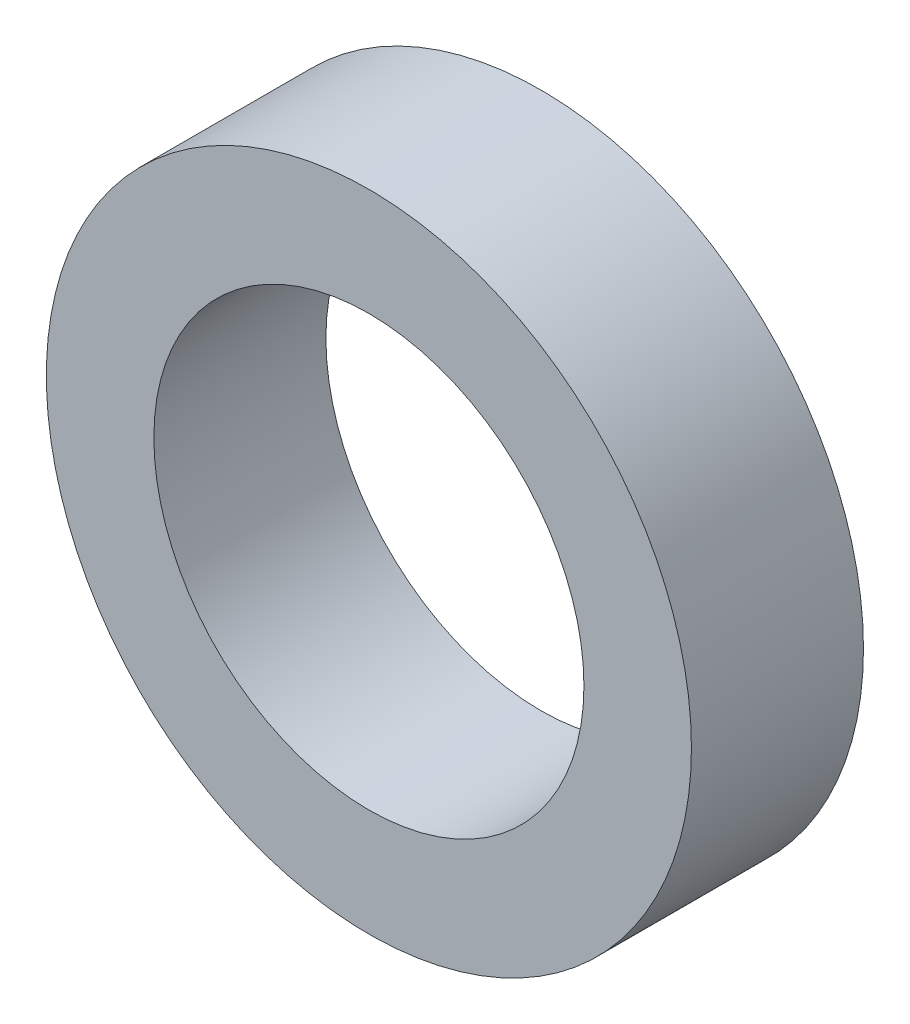
ISO-10303-21;
HEADER;
FILE_DESCRIPTION(('STEP AP214'),'2;1');
FILE_NAME('part.step','',(''),(''),'','','');
FILE_SCHEMA(('AUTOMOTIVE_DESIGN { 1 0 10303 214 1 1 1 1 }'));
ENDSEC;
DATA;
#1=APPLICATION_CONTEXT('core data for automotive mechanical design processes');
#2=APPLICATION_PROTOCOL_DEFINITION('international standard','automotive_design',2000,#1);
#3=PRODUCT_CONTEXT('',#1,'mechanical');
#4=PRODUCT('Part','Part','',(#3));
#5=PRODUCT_RELATED_PRODUCT_CATEGORY('part','',(#4));
#6=PRODUCT_DEFINITION_FORMATION('','',#4);
#7=PRODUCT_DEFINITION_CONTEXT('part definition',#1,'design');
#8=PRODUCT_DEFINITION('design','',#6,#7);
#9=PRODUCT_DEFINITION_SHAPE('','',#8);
#10=(LENGTH_UNIT() NAMED_UNIT(*) SI_UNIT(.MILLI.,.METRE.));
#11=(NAMED_UNIT(*) PLANE_ANGLE_UNIT() SI_UNIT($,.RADIAN.));
#12=(NAMED_UNIT(*) SI_UNIT($,.STERADIAN.) SOLID_ANGLE_UNIT());
#13=UNCERTAINTY_MEASURE_WITH_UNIT(LENGTH_MEASURE(1.E-05),#10,'distance_accuracy_value','');
#14=(GEOMETRIC_REPRESENTATION_CONTEXT(3) GLOBAL_UNCERTAINTY_ASSIGNED_CONTEXT((#13)) GLOBAL_UNIT_ASSIGNED_CONTEXT((#10,
#11,#12)) REPRESENTATION_CONTEXT('',''));
#15=CARTESIAN_POINT('',(0.,0.,0.));
#16=DIRECTION('',(0.,0.,1.));
#17=DIRECTION('',(1.,0.,0.));
#18=AXIS2_PLACEMENT_3D('',#15,#16,#17);
#19=CARTESIAN_POINT('',(0.,0.,4.));
#20=DIRECTION('',(0.,0.,1.));
#21=DIRECTION('',(1.,0.,0.));
#22=AXIS2_PLACEMENT_3D('',#19,#20,#21);
#23=PLANE('',#22);
#24=CARTESIAN_POINT('',(0.,0.,4.));
#25=DIRECTION('',(0.,0.,1.));
#26=DIRECTION('',(1.,0.,0.));
#27=AXIS2_PLACEMENT_3D('',#24,#25,#26);
#28=CIRCLE('',#27,7.5);
#29=CARTESIAN_POINT('',(7.5,0.,4.));
#30=VERTEX_POINT('',#29);
#31=EDGE_CURVE('E10',#30,#30,#28,.T.);
#32=ORIENTED_EDGE('',*,*,#31,.T.);
#33=EDGE_LOOP('',(#32));
#34=FACE_BOUND('',#33,.T.);
#35=CARTESIAN_POINT('',(0.,0.,4.));
#36=DIRECTION('',(0.,0.,1.));
#37=DIRECTION('',(1.,0.,0.));
#38=AXIS2_PLACEMENT_3D('',#35,#36,#37);
#39=CIRCLE('',#38,5.);
#40=CARTESIAN_POINT('',(5.,0.,4.));
#41=VERTEX_POINT('',#40);
#42=EDGE_CURVE('E41',#41,#41,#39,.T.);
#43=ORIENTED_EDGE('',*,*,#42,.F.);
#44=EDGE_LOOP('',(#43));
#45=FACE_BOUND('',#44,.T.);
#46=ADVANCED_FACE('F30',(#34,#45),#23,.T.);
#47=CARTESIAN_POINT('',(0.,0.,0.));
#48=DIRECTION('',(0.,0.,1.));
#49=DIRECTION('',(1.,0.,0.));
#50=AXIS2_PLACEMENT_3D('',#47,#48,#49);
#51=PLANE('',#50);
#52=CARTESIAN_POINT('',(0.,0.,0.));
#53=DIRECTION('',(0.,0.,1.));
#54=DIRECTION('',(1.,0.,0.));
#55=AXIS2_PLACEMENT_3D('',#52,#53,#54);
#56=CIRCLE('',#55,7.5);
#57=CARTESIAN_POINT('',(7.5,0.,0.));
#58=VERTEX_POINT('',#57);
#59=EDGE_CURVE('E34',#58,#58,#56,.T.);
#60=ORIENTED_EDGE('',*,*,#59,.F.);
#61=EDGE_LOOP('',(#60));
#62=FACE_BOUND('',#61,.T.);
#63=CARTESIAN_POINT('',(0.,0.,0.));
#64=DIRECTION('',(0.,0.,1.));
#65=DIRECTION('',(1.,0.,0.));
#66=AXIS2_PLACEMENT_3D('',#63,#64,#65);
#67=CIRCLE('',#66,5.);
#68=CARTESIAN_POINT('',(5.,0.,0.));
#69=VERTEX_POINT('',#68);
#70=EDGE_CURVE('E43',#69,#69,#67,.T.);
#71=ORIENTED_EDGE('',*,*,#70,.T.);
#72=EDGE_LOOP('',(#71));
#73=FACE_BOUND('',#72,.T.);
#74=ADVANCED_FACE('F53',(#62,#73),#51,.F.);
#75=CARTESIAN_POINT('',(0.,0.,4.));
#76=DIRECTION('',(0.,0.,-1.));
#77=DIRECTION('',(-1.,0.,0.));
#78=AXIS2_PLACEMENT_3D('',#75,#76,#77);
#79=CYLINDRICAL_SURFACE('',#78,7.5);
#80=ORIENTED_EDGE('',*,*,#31,.F.);
#81=EDGE_LOOP('',(#80));
#82=FACE_BOUND('',#81,.T.);
#83=ORIENTED_EDGE('',*,*,#59,.T.);
#84=EDGE_LOOP('',(#83));
#85=FACE_BOUND('',#84,.T.);
#86=ADVANCED_FACE('F32',(#82,#85),#79,.T.);
#87=CARTESIAN_POINT('',(0.,0.,4.));
#88=DIRECTION('',(0.,0.,-1.));
#89=DIRECTION('',(-1.,0.,0.));
#90=AXIS2_PLACEMENT_3D('',#87,#88,#89);
#91=CYLINDRICAL_SURFACE('',#90,5.);
#92=ORIENTED_EDGE('',*,*,#42,.T.);
#93=EDGE_LOOP('',(#92));
#94=FACE_BOUND('',#93,.T.);
#95=ORIENTED_EDGE('',*,*,#70,.F.);
#96=EDGE_LOOP('',(#95));
#97=FACE_BOUND('',#96,.T.);
#98=ADVANCED_FACE('F49',(#94,#97),#91,.F.);
#99=CLOSED_SHELL('',(#46,#74,#86,#98));
#100=MANIFOLD_SOLID_BREP('B2',#99);
#101=ADVANCED_BREP_SHAPE_REPRESENTATION('',(#18,#100),#14);
#102=SHAPE_DEFINITION_REPRESENTATION(#9,#101);
ENDSEC;
END-ISO-10303-21;
